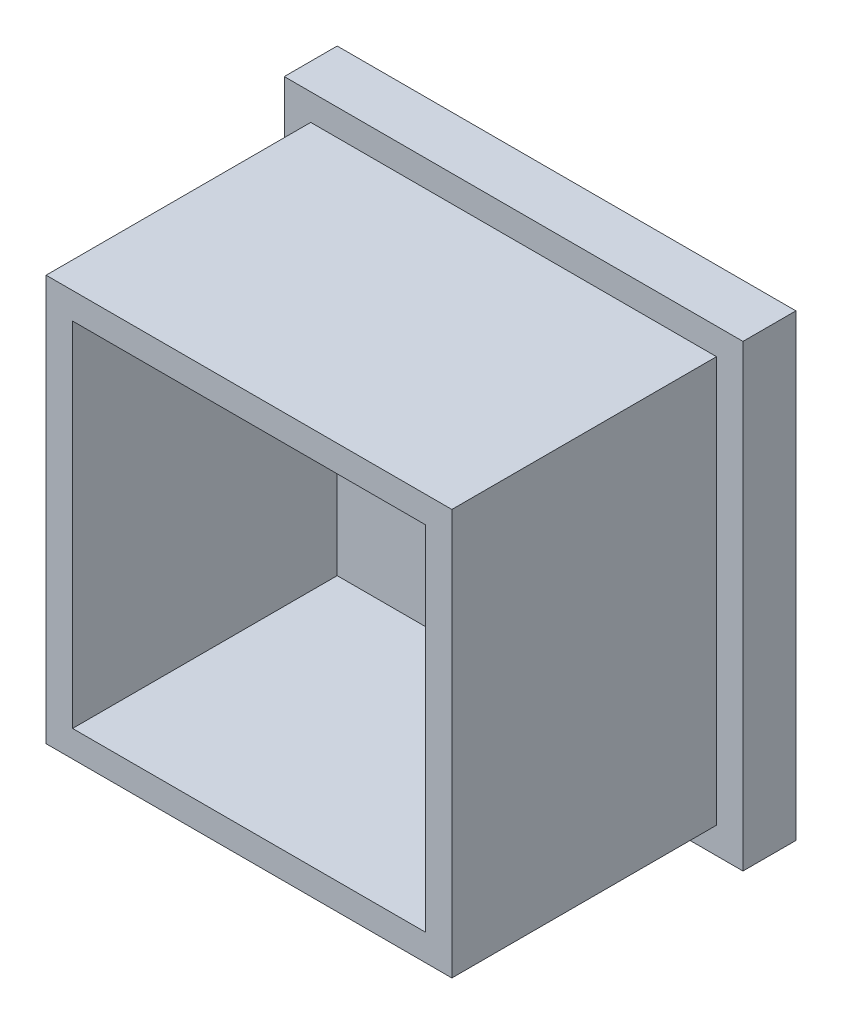
ISO-10303-21;
HEADER;
FILE_DESCRIPTION(('STEP AP214'),'2;1');
FILE_NAME('part.step','',(''),(''),'','','');
FILE_SCHEMA(('AUTOMOTIVE_DESIGN { 1 0 10303 214 1 1 1 1 }'));
ENDSEC;
DATA;
#1=APPLICATION_CONTEXT('core data for automotive mechanical design processes');
#2=APPLICATION_PROTOCOL_DEFINITION('international standard','automotive_design',2000,#1);
#3=PRODUCT_CONTEXT('',#1,'mechanical');
#4=PRODUCT('Part','Part','',(#3));
#5=PRODUCT_RELATED_PRODUCT_CATEGORY('part','',(#4));
#6=PRODUCT_DEFINITION_FORMATION('','',#4);
#7=PRODUCT_DEFINITION_CONTEXT('part definition',#1,'design');
#8=PRODUCT_DEFINITION('design','',#6,#7);
#9=PRODUCT_DEFINITION_SHAPE('','',#8);
#10=(LENGTH_UNIT() NAMED_UNIT(*) SI_UNIT(.MILLI.,.METRE.));
#11=(NAMED_UNIT(*) PLANE_ANGLE_UNIT() SI_UNIT($,.RADIAN.));
#12=(NAMED_UNIT(*) SI_UNIT($,.STERADIAN.) SOLID_ANGLE_UNIT());
#13=UNCERTAINTY_MEASURE_WITH_UNIT(LENGTH_MEASURE(1.E-05),#10,'distance_accuracy_value','');
#14=(GEOMETRIC_REPRESENTATION_CONTEXT(3) GLOBAL_UNCERTAINTY_ASSIGNED_CONTEXT((#13)) GLOBAL_UNIT_ASSIGNED_CONTEXT((#10,
#11,#12)) REPRESENTATION_CONTEXT('',''));
#15=CARTESIAN_POINT('',(0.,0.,0.));
#16=DIRECTION('',(0.,0.,1.));
#17=DIRECTION('',(1.,0.,0.));
#18=AXIS2_PLACEMENT_3D('',#15,#16,#17);
#19=CARTESIAN_POINT('',(0.,0.,3.));
#20=DIRECTION('',(0.,0.,1.));
#21=DIRECTION('',(1.,0.,0.));
#22=AXIS2_PLACEMENT_3D('',#19,#20,#21);
#23=PLANE('',#22);
#24=DIRECTION('',(0.,-1.,0.));
#25=VECTOR('',#24,1.);
#26=CARTESIAN_POINT('',(0.,0.,3.));
#27=LINE('',#26,#25);
#28=CARTESIAN_POINT('',(0.,0.,3.));
#29=VERTEX_POINT('',#28);
#30=CARTESIAN_POINT('',(0.,-26.,3.));
#31=VERTEX_POINT('',#30);
#32=EDGE_CURVE('E190',#29,#31,#27,.T.);
#33=ORIENTED_EDGE('',*,*,#32,.T.);
#34=DIRECTION('',(1.,0.,0.));
#35=VECTOR('',#34,1.);
#36=CARTESIAN_POINT('',(0.,-26.,3.));
#37=LINE('',#36,#35);
#38=CARTESIAN_POINT('',(26.,-26.,3.));
#39=VERTEX_POINT('',#38);
#40=EDGE_CURVE('E193',#31,#39,#37,.T.);
#41=ORIENTED_EDGE('',*,*,#40,.T.);
#42=DIRECTION('',(0.,1.,0.));
#43=VECTOR('',#42,1.);
#44=CARTESIAN_POINT('',(26.,0.,3.));
#45=LINE('',#44,#43);
#46=CARTESIAN_POINT('',(26.,0.,3.));
#47=VERTEX_POINT('',#46);
#48=EDGE_CURVE('E196',#39,#47,#45,.T.);
#49=ORIENTED_EDGE('',*,*,#48,.T.);
#50=DIRECTION('',(-1.,0.,0.));
#51=VECTOR('',#50,1.);
#52=CARTESIAN_POINT('',(0.,0.,3.));
#53=LINE('',#52,#51);
#54=EDGE_CURVE('E198',#47,#29,#53,.T.);
#55=ORIENTED_EDGE('',*,*,#54,.T.);
#56=EDGE_LOOP('',(#33,#41,#49,#55));
#57=FACE_BOUND('',#56,.T.);
#58=DIRECTION('',(1.,0.,0.));
#59=VECTOR('',#58,1.);
#60=CARTESIAN_POINT('',(1.5,-24.5,3.));
#61=LINE('',#60,#59);
#62=CARTESIAN_POINT('',(1.5,-24.5,3.));
#63=VERTEX_POINT('',#62);
#64=CARTESIAN_POINT('',(24.5,-24.5,3.));
#65=VERTEX_POINT('',#64);
#66=EDGE_CURVE('E176',#63,#65,#61,.T.);
#67=ORIENTED_EDGE('',*,*,#66,.F.);
#68=DIRECTION('',(0.,-1.,0.));
#69=VECTOR('',#68,1.);
#70=CARTESIAN_POINT('',(1.5,-1.5,3.));
#71=LINE('',#70,#69);
#72=CARTESIAN_POINT('',(1.5,-1.5,3.));
#73=VERTEX_POINT('',#72);
#74=EDGE_CURVE('E141',#73,#63,#71,.T.);
#75=ORIENTED_EDGE('',*,*,#74,.F.);
#76=DIRECTION('',(-1.,0.,0.));
#77=VECTOR('',#76,1.);
#78=CARTESIAN_POINT('',(1.5,-1.5,3.));
#79=LINE('',#78,#77);
#80=CARTESIAN_POINT('',(24.5,-1.5,3.));
#81=VERTEX_POINT('',#80);
#82=EDGE_CURVE('E167',#81,#73,#79,.T.);
#83=ORIENTED_EDGE('',*,*,#82,.F.);
#84=DIRECTION('',(0.,1.,0.));
#85=VECTOR('',#84,1.);
#86=CARTESIAN_POINT('',(24.5,-1.5,3.));
#87=LINE('',#86,#85);
#88=EDGE_CURVE('E178',#65,#81,#87,.T.);
#89=ORIENTED_EDGE('',*,*,#88,.F.);
#90=EDGE_LOOP('',(#67,#75,#83,#89));
#91=FACE_BOUND('',#90,.T.);
#92=ADVANCED_FACE('F33',(#57,#91),#23,.T.);
#93=CARTESIAN_POINT('',(0.,0.,3.));
#94=DIRECTION('',(1.,0.,0.));
#95=DIRECTION('',(0.,1.,0.));
#96=AXIS2_PLACEMENT_3D('',#93,#94,#95);
#97=PLANE('',#96);
#98=DIRECTION('',(0.,-1.,0.));
#99=VECTOR('',#98,1.);
#100=CARTESIAN_POINT('',(0.,0.,0.));
#101=LINE('',#100,#99);
#102=CARTESIAN_POINT('',(0.,0.,0.));
#103=VERTEX_POINT('',#102);
#104=CARTESIAN_POINT('',(0.,-26.,0.));
#105=VERTEX_POINT('',#104);
#106=EDGE_CURVE('E189',#103,#105,#101,.T.);
#107=ORIENTED_EDGE('',*,*,#106,.T.);
#108=DIRECTION('',(0.,0.,-1.));
#109=VECTOR('',#108,1.);
#110=CARTESIAN_POINT('',(0.,-26.,3.));
#111=LINE('',#110,#109);
#112=EDGE_CURVE('E11',#31,#105,#111,.T.);
#113=ORIENTED_EDGE('',*,*,#112,.F.);
#114=ORIENTED_EDGE('',*,*,#32,.F.);
#115=DIRECTION('',(0.,0.,-1.));
#116=VECTOR('',#115,1.);
#117=CARTESIAN_POINT('',(0.,0.,3.));
#118=LINE('',#117,#116);
#119=EDGE_CURVE('E200',#29,#103,#118,.T.);
#120=ORIENTED_EDGE('',*,*,#119,.T.);
#121=EDGE_LOOP('',(#107,#113,#114,#120));
#122=FACE_BOUND('',#121,.T.);
#123=ADVANCED_FACE('F35',(#122),#97,.F.);
#124=CARTESIAN_POINT('',(0.,-26.,3.));
#125=DIRECTION('',(0.,1.,0.));
#126=DIRECTION('',(0.,0.,1.));
#127=AXIS2_PLACEMENT_3D('',#124,#125,#126);
#128=PLANE('',#127);
#129=DIRECTION('',(1.,0.,0.));
#130=VECTOR('',#129,1.);
#131=CARTESIAN_POINT('',(0.,-26.,0.));
#132=LINE('',#131,#130);
#133=CARTESIAN_POINT('',(26.,-26.,0.));
#134=VERTEX_POINT('',#133);
#135=EDGE_CURVE('E203',#105,#134,#132,.T.);
#136=ORIENTED_EDGE('',*,*,#135,.T.);
#137=DIRECTION('',(0.,0.,-1.));
#138=VECTOR('',#137,1.);
#139=CARTESIAN_POINT('',(26.,-26.,3.));
#140=LINE('',#139,#138);
#141=EDGE_CURVE('E41',#39,#134,#140,.T.);
#142=ORIENTED_EDGE('',*,*,#141,.F.);
#143=ORIENTED_EDGE('',*,*,#40,.F.);
#144=ORIENTED_EDGE('',*,*,#112,.T.);
#145=EDGE_LOOP('',(#136,#142,#143,#144));
#146=FACE_BOUND('',#145,.T.);
#147=ADVANCED_FACE('F233',(#146),#128,.F.);
#148=CARTESIAN_POINT('',(26.,0.,3.));
#149=DIRECTION('',(-1.,0.,0.));
#150=DIRECTION('',(0.,-1.,0.));
#151=AXIS2_PLACEMENT_3D('',#148,#149,#150);
#152=PLANE('',#151);
#153=DIRECTION('',(0.,1.,0.));
#154=VECTOR('',#153,1.);
#155=CARTESIAN_POINT('',(26.,0.,0.));
#156=LINE('',#155,#154);
#157=CARTESIAN_POINT('',(26.,0.,0.));
#158=VERTEX_POINT('',#157);
#159=EDGE_CURVE('E205',#134,#158,#156,.T.);
#160=ORIENTED_EDGE('',*,*,#159,.T.);
#161=DIRECTION('',(0.,0.,-1.));
#162=VECTOR('',#161,1.);
#163=CARTESIAN_POINT('',(26.,0.,3.));
#164=LINE('',#163,#162);
#165=EDGE_CURVE('E210',#47,#158,#164,.T.);
#166=ORIENTED_EDGE('',*,*,#165,.F.);
#167=ORIENTED_EDGE('',*,*,#48,.F.);
#168=ORIENTED_EDGE('',*,*,#141,.T.);
#169=EDGE_LOOP('',(#160,#166,#167,#168));
#170=FACE_BOUND('',#169,.T.);
#171=ADVANCED_FACE('F217',(#170),#152,.F.);
#172=CARTESIAN_POINT('',(0.,0.,3.));
#173=DIRECTION('',(0.,-1.,0.));
#174=DIRECTION('',(0.,0.,-1.));
#175=AXIS2_PLACEMENT_3D('',#172,#173,#174);
#176=PLANE('',#175);
#177=DIRECTION('',(-1.,0.,0.));
#178=VECTOR('',#177,1.);
#179=CARTESIAN_POINT('',(0.,0.,0.));
#180=LINE('',#179,#178);
#181=EDGE_CURVE('E194',#158,#103,#180,.T.);
#182=ORIENTED_EDGE('',*,*,#181,.T.);
#183=ORIENTED_EDGE('',*,*,#119,.F.);
#184=ORIENTED_EDGE('',*,*,#54,.F.);
#185=ORIENTED_EDGE('',*,*,#165,.T.);
#186=EDGE_LOOP('',(#182,#183,#184,#185));
#187=FACE_BOUND('',#186,.T.);
#188=ADVANCED_FACE('F226',(#187),#176,.F.);
#189=CARTESIAN_POINT('',(0.,0.,0.));
#190=DIRECTION('',(0.,0.,1.));
#191=DIRECTION('',(1.,0.,0.));
#192=AXIS2_PLACEMENT_3D('',#189,#190,#191);
#193=PLANE('',#192);
#194=ORIENTED_EDGE('',*,*,#106,.F.);
#195=ORIENTED_EDGE('',*,*,#181,.F.);
#196=ORIENTED_EDGE('',*,*,#159,.F.);
#197=ORIENTED_EDGE('',*,*,#135,.F.);
#198=EDGE_LOOP('',(#194,#195,#196,#197));
#199=FACE_BOUND('',#198,.T.);
#200=ADVANCED_FACE('F223',(#199),#193,.F.);
#201=CARTESIAN_POINT('',(0.,0.,18.));
#202=DIRECTION('',(0.,0.,1.));
#203=DIRECTION('',(1.,0.,0.));
#204=AXIS2_PLACEMENT_3D('',#201,#202,#203);
#205=PLANE('',#204);
#206=DIRECTION('',(0.,-1.,0.));
#207=VECTOR('',#206,1.);
#208=CARTESIAN_POINT('',(1.5,-1.5,18.));
#209=LINE('',#208,#207);
#210=CARTESIAN_POINT('',(1.5,-1.5,18.));
#211=VERTEX_POINT('',#210);
#212=CARTESIAN_POINT('',(1.5,-24.5,18.));
#213=VERTEX_POINT('',#212);
#214=EDGE_CURVE('E163',#211,#213,#209,.T.);
#215=ORIENTED_EDGE('',*,*,#214,.T.);
#216=DIRECTION('',(1.,0.,0.));
#217=VECTOR('',#216,1.);
#218=CARTESIAN_POINT('',(1.5,-24.5,18.));
#219=LINE('',#218,#217);
#220=CARTESIAN_POINT('',(24.5,-24.5,18.));
#221=VERTEX_POINT('',#220);
#222=EDGE_CURVE('E166',#213,#221,#219,.T.);
#223=ORIENTED_EDGE('',*,*,#222,.T.);
#224=DIRECTION('',(0.,1.,0.));
#225=VECTOR('',#224,1.);
#226=CARTESIAN_POINT('',(24.5,-1.5,18.));
#227=LINE('',#226,#225);
#228=CARTESIAN_POINT('',(24.5,-1.5,18.));
#229=VERTEX_POINT('',#228);
#230=EDGE_CURVE('E169',#221,#229,#227,.T.);
#231=ORIENTED_EDGE('',*,*,#230,.T.);
#232=DIRECTION('',(-1.,0.,0.));
#233=VECTOR('',#232,1.);
#234=CARTESIAN_POINT('',(1.5,-1.5,18.));
#235=LINE('',#234,#233);
#236=EDGE_CURVE('E171',#229,#211,#235,.T.);
#237=ORIENTED_EDGE('',*,*,#236,.T.);
#238=EDGE_LOOP('',(#215,#223,#231,#237));
#239=FACE_BOUND('',#238,.T.);
#240=DIRECTION('',(0.,-1.,0.));
#241=VECTOR('',#240,1.);
#242=CARTESIAN_POINT('',(3.,-3.,18.));
#243=LINE('',#242,#241);
#244=CARTESIAN_POINT('',(3.,-3.,18.));
#245=VERTEX_POINT('',#244);
#246=CARTESIAN_POINT('',(3.,-23.,18.));
#247=VERTEX_POINT('',#246);
#248=EDGE_CURVE('E133',#245,#247,#243,.T.);
#249=ORIENTED_EDGE('',*,*,#248,.F.);
#250=DIRECTION('',(-1.,0.,0.));
#251=VECTOR('',#250,1.);
#252=CARTESIAN_POINT('',(3.,-3.,18.));
#253=LINE('',#252,#251);
#254=CARTESIAN_POINT('',(23.,-3.,18.));
#255=VERTEX_POINT('',#254);
#256=EDGE_CURVE('E124',#255,#245,#253,.T.);
#257=ORIENTED_EDGE('',*,*,#256,.F.);
#258=DIRECTION('',(0.,1.,0.));
#259=VECTOR('',#258,1.);
#260=CARTESIAN_POINT('',(23.,-3.,18.));
#261=LINE('',#260,#259);
#262=CARTESIAN_POINT('',(23.,-23.,18.));
#263=VERTEX_POINT('',#262);
#264=EDGE_CURVE('E149',#263,#255,#261,.T.);
#265=ORIENTED_EDGE('',*,*,#264,.F.);
#266=DIRECTION('',(1.,0.,0.));
#267=VECTOR('',#266,1.);
#268=CARTESIAN_POINT('',(3.,-23.,18.));
#269=LINE('',#268,#267);
#270=EDGE_CURVE('E147',#247,#263,#269,.T.);
#271=ORIENTED_EDGE('',*,*,#270,.F.);
#272=EDGE_LOOP('',(#249,#257,#265,#271));
#273=FACE_BOUND('',#272,.T.);
#274=ADVANCED_FACE('F145',(#239,#273),#205,.T.);
#275=CARTESIAN_POINT('',(1.5,-1.5,18.));
#276=DIRECTION('',(1.,0.,0.));
#277=DIRECTION('',(0.,1.,0.));
#278=AXIS2_PLACEMENT_3D('',#275,#276,#277);
#279=PLANE('',#278);
#280=ORIENTED_EDGE('',*,*,#74,.T.);
#281=DIRECTION('',(0.,0.,-1.));
#282=VECTOR('',#281,1.);
#283=CARTESIAN_POINT('',(1.5,-24.5,18.));
#284=LINE('',#283,#282);
#285=EDGE_CURVE('E187',#213,#63,#284,.T.);
#286=ORIENTED_EDGE('',*,*,#285,.F.);
#287=ORIENTED_EDGE('',*,*,#214,.F.);
#288=DIRECTION('',(0.,0.,-1.));
#289=VECTOR('',#288,1.);
#290=CARTESIAN_POINT('',(1.5,-1.5,18.));
#291=LINE('',#290,#289);
#292=EDGE_CURVE('E173',#211,#73,#291,.T.);
#293=ORIENTED_EDGE('',*,*,#292,.T.);
#294=EDGE_LOOP('',(#280,#286,#287,#293));
#295=FACE_BOUND('',#294,.T.);
#296=ADVANCED_FACE('F269',(#295),#279,.F.);
#297=CARTESIAN_POINT('',(1.5,-24.5,18.));
#298=DIRECTION('',(0.,1.,0.));
#299=DIRECTION('',(0.,0.,1.));
#300=AXIS2_PLACEMENT_3D('',#297,#298,#299);
#301=PLANE('',#300);
#302=ORIENTED_EDGE('',*,*,#66,.T.);
#303=DIRECTION('',(0.,0.,-1.));
#304=VECTOR('',#303,1.);
#305=CARTESIAN_POINT('',(24.5,-24.5,18.));
#306=LINE('',#305,#304);
#307=EDGE_CURVE('E184',#221,#65,#306,.T.);
#308=ORIENTED_EDGE('',*,*,#307,.F.);
#309=ORIENTED_EDGE('',*,*,#222,.F.);
#310=ORIENTED_EDGE('',*,*,#285,.T.);
#311=EDGE_LOOP('',(#302,#308,#309,#310));
#312=FACE_BOUND('',#311,.T.);
#313=ADVANCED_FACE('F276',(#312),#301,.F.);
#314=CARTESIAN_POINT('',(24.5,-1.5,18.));
#315=DIRECTION('',(-1.,0.,0.));
#316=DIRECTION('',(0.,0.,1.));
#317=AXIS2_PLACEMENT_3D('',#314,#315,#316);
#318=PLANE('',#317);
#319=ORIENTED_EDGE('',*,*,#88,.T.);
#320=DIRECTION('',(0.,0.,-1.));
#321=VECTOR('',#320,1.);
#322=CARTESIAN_POINT('',(24.5,-1.5,18.));
#323=LINE('',#322,#321);
#324=EDGE_CURVE('E48',#229,#81,#323,.T.);
#325=ORIENTED_EDGE('',*,*,#324,.F.);
#326=ORIENTED_EDGE('',*,*,#230,.F.);
#327=ORIENTED_EDGE('',*,*,#307,.T.);
#328=EDGE_LOOP('',(#319,#325,#326,#327));
#329=FACE_BOUND('',#328,.T.);
#330=ADVANCED_FACE('F273',(#329),#318,.F.);
#331=CARTESIAN_POINT('',(1.5,-1.5,18.));
#332=DIRECTION('',(0.,-1.,0.));
#333=DIRECTION('',(0.,0.,-1.));
#334=AXIS2_PLACEMENT_3D('',#331,#332,#333);
#335=PLANE('',#334);
#336=ORIENTED_EDGE('',*,*,#82,.T.);
#337=ORIENTED_EDGE('',*,*,#292,.F.);
#338=ORIENTED_EDGE('',*,*,#236,.F.);
#339=ORIENTED_EDGE('',*,*,#324,.T.);
#340=EDGE_LOOP('',(#336,#337,#338,#339));
#341=FACE_BOUND('',#340,.T.);
#342=ADVANCED_FACE('F266',(#341),#335,.F.);
#343=CARTESIAN_POINT('',(3.,-3.,18.));
#344=DIRECTION('',(0.,-1.,0.));
#345=DIRECTION('',(0.,0.,-1.));
#346=AXIS2_PLACEMENT_3D('',#343,#344,#345);
#347=PLANE('',#346);
#348=DIRECTION('',(-1.,0.,0.));
#349=VECTOR('',#348,1.);
#350=CARTESIAN_POINT('',(3.,-3.,3.));
#351=LINE('',#350,#349);
#352=CARTESIAN_POINT('',(23.,-3.,3.));
#353=VERTEX_POINT('',#352);
#354=CARTESIAN_POINT('',(3.,-3.,3.));
#355=VERTEX_POINT('',#354);
#356=EDGE_CURVE('E56',#353,#355,#351,.T.);
#357=ORIENTED_EDGE('',*,*,#356,.F.);
#358=DIRECTION('',(0.,0.,-1.));
#359=VECTOR('',#358,1.);
#360=CARTESIAN_POINT('',(23.,-3.,18.));
#361=LINE('',#360,#359);
#362=EDGE_CURVE('E129',#255,#353,#361,.T.);
#363=ORIENTED_EDGE('',*,*,#362,.F.);
#364=ORIENTED_EDGE('',*,*,#256,.T.);
#365=DIRECTION('',(0.,0.,-1.));
#366=VECTOR('',#365,1.);
#367=CARTESIAN_POINT('',(3.,-3.,18.));
#368=LINE('',#367,#366);
#369=EDGE_CURVE('E127',#245,#355,#368,.T.);
#370=ORIENTED_EDGE('',*,*,#369,.T.);
#371=EDGE_LOOP('',(#357,#363,#364,#370));
#372=FACE_BOUND('',#371,.T.);
#373=ADVANCED_FACE('F126',(#372),#347,.T.);
#374=CARTESIAN_POINT('',(3.,-3.,18.));
#375=DIRECTION('',(1.,0.,0.));
#376=DIRECTION('',(0.,0.,-1.));
#377=AXIS2_PLACEMENT_3D('',#374,#375,#376);
#378=PLANE('',#377);
#379=DIRECTION('',(0.,-1.,0.));
#380=VECTOR('',#379,1.);
#381=CARTESIAN_POINT('',(3.,-3.,3.));
#382=LINE('',#381,#380);
#383=CARTESIAN_POINT('',(3.,-23.,3.));
#384=VERTEX_POINT('',#383);
#385=EDGE_CURVE('E140',#355,#384,#382,.T.);
#386=ORIENTED_EDGE('',*,*,#385,.F.);
#387=ORIENTED_EDGE('',*,*,#369,.F.);
#388=ORIENTED_EDGE('',*,*,#248,.T.);
#389=DIRECTION('',(0.,0.,-1.));
#390=VECTOR('',#389,1.);
#391=CARTESIAN_POINT('',(3.,-23.,18.));
#392=LINE('',#391,#390);
#393=EDGE_CURVE('E142',#247,#384,#392,.T.);
#394=ORIENTED_EDGE('',*,*,#393,.T.);
#395=EDGE_LOOP('',(#386,#387,#388,#394));
#396=FACE_BOUND('',#395,.T.);
#397=ADVANCED_FACE('F137',(#396),#378,.T.);
#398=CARTESIAN_POINT('',(3.,-23.,18.));
#399=DIRECTION('',(0.,1.,0.));
#400=DIRECTION('',(0.,0.,1.));
#401=AXIS2_PLACEMENT_3D('',#398,#399,#400);
#402=PLANE('',#401);
#403=DIRECTION('',(1.,0.,0.));
#404=VECTOR('',#403,1.);
#405=CARTESIAN_POINT('',(3.,-23.,3.));
#406=LINE('',#405,#404);
#407=CARTESIAN_POINT('',(23.,-23.,3.));
#408=VERTEX_POINT('',#407);
#409=EDGE_CURVE('E155',#384,#408,#406,.T.);
#410=ORIENTED_EDGE('',*,*,#409,.F.);
#411=ORIENTED_EDGE('',*,*,#393,.F.);
#412=ORIENTED_EDGE('',*,*,#270,.T.);
#413=DIRECTION('',(0.,0.,-1.));
#414=VECTOR('',#413,1.);
#415=CARTESIAN_POINT('',(23.,-23.,18.));
#416=LINE('',#415,#414);
#417=EDGE_CURVE('E159',#263,#408,#416,.T.);
#418=ORIENTED_EDGE('',*,*,#417,.T.);
#419=EDGE_LOOP('',(#410,#411,#412,#418));
#420=FACE_BOUND('',#419,.T.);
#421=ADVANCED_FACE('F252',(#420),#402,.T.);
#422=CARTESIAN_POINT('',(23.,-3.,18.));
#423=DIRECTION('',(-1.,0.,0.));
#424=DIRECTION('',(0.,0.,1.));
#425=AXIS2_PLACEMENT_3D('',#422,#423,#424);
#426=PLANE('',#425);
#427=DIRECTION('',(0.,1.,0.));
#428=VECTOR('',#427,1.);
#429=CARTESIAN_POINT('',(23.,-3.,3.));
#430=LINE('',#429,#428);
#431=EDGE_CURVE('E134',#408,#353,#430,.T.);
#432=ORIENTED_EDGE('',*,*,#431,.F.);
#433=ORIENTED_EDGE('',*,*,#417,.F.);
#434=ORIENTED_EDGE('',*,*,#264,.T.);
#435=ORIENTED_EDGE('',*,*,#362,.T.);
#436=EDGE_LOOP('',(#432,#433,#434,#435));
#437=FACE_BOUND('',#436,.T.);
#438=ADVANCED_FACE('F248',(#437),#426,.T.);
#439=ORIENTED_EDGE('',*,*,#356,.T.);
#440=ORIENTED_EDGE('',*,*,#385,.T.);
#441=ORIENTED_EDGE('',*,*,#409,.T.);
#442=ORIENTED_EDGE('',*,*,#431,.T.);
#443=EDGE_LOOP('',(#439,#440,#441,#442));
#444=FACE_BOUND('',#443,.T.);
#445=ADVANCED_FACE('F242',(#444),#23,.T.);
#446=CLOSED_SHELL('',(#92,#123,#147,#171,#188,#200,#274,#296,#313,#330,#342,#373,#397,#421,#438,#445));
#447=MANIFOLD_SOLID_BREP('B2',#446);
#448=ADVANCED_BREP_SHAPE_REPRESENTATION('',(#18,#447),#14);
#449=SHAPE_DEFINITION_REPRESENTATION(#9,#448);
ENDSEC;
END-ISO-10303-21;
